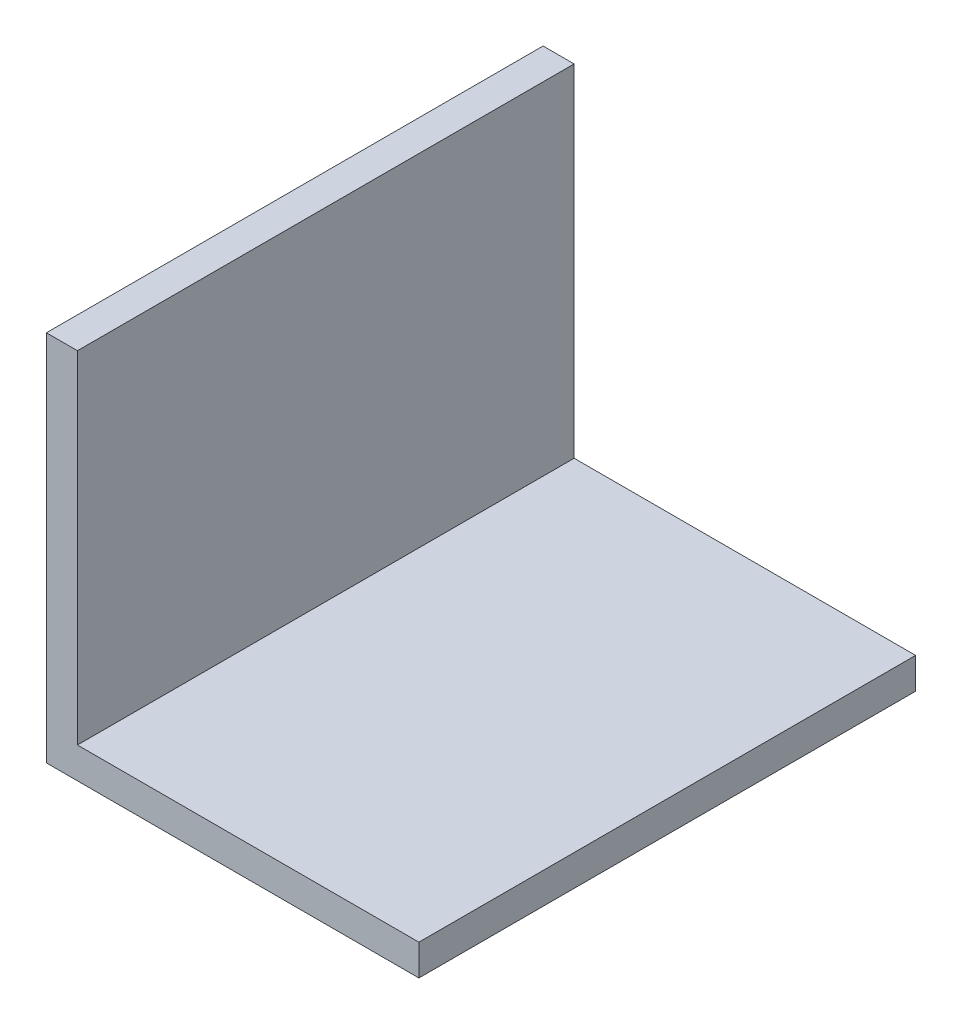
ISO-10303-21;
HEADER;
FILE_DESCRIPTION(('STEP AP214'),'2;1');
FILE_NAME('part.step','',(''),(''),'','','');
FILE_SCHEMA(('AUTOMOTIVE_DESIGN { 1 0 10303 214 1 1 1 1 }'));
ENDSEC;
DATA;
#1=APPLICATION_CONTEXT('core data for automotive mechanical design processes');
#2=APPLICATION_PROTOCOL_DEFINITION('international standard','automotive_design',2000,#1);
#3=PRODUCT_CONTEXT('',#1,'mechanical');
#4=PRODUCT('Part','Part','',(#3));
#5=PRODUCT_RELATED_PRODUCT_CATEGORY('part','',(#4));
#6=PRODUCT_DEFINITION_FORMATION('','',#4);
#7=PRODUCT_DEFINITION_CONTEXT('part definition',#1,'design');
#8=PRODUCT_DEFINITION('design','',#6,#7);
#9=PRODUCT_DEFINITION_SHAPE('','',#8);
#10=(LENGTH_UNIT() NAMED_UNIT(*) SI_UNIT(.MILLI.,.METRE.));
#11=(NAMED_UNIT(*) PLANE_ANGLE_UNIT() SI_UNIT($,.RADIAN.));
#12=(NAMED_UNIT(*) SI_UNIT($,.STERADIAN.) SOLID_ANGLE_UNIT());
#13=UNCERTAINTY_MEASURE_WITH_UNIT(LENGTH_MEASURE(1.E-05),#10,'distance_accuracy_value','');
#14=(GEOMETRIC_REPRESENTATION_CONTEXT(3) GLOBAL_UNCERTAINTY_ASSIGNED_CONTEXT((#13)) GLOBAL_UNIT_ASSIGNED_CONTEXT((#10,
#11,#12)) REPRESENTATION_CONTEXT('',''));
#15=CARTESIAN_POINT('',(0.,0.,0.));
#16=DIRECTION('',(0.,0.,1.));
#17=DIRECTION('',(1.,0.,0.));
#18=AXIS2_PLACEMENT_3D('',#15,#16,#17);
#19=CARTESIAN_POINT('',(0.,0.,25.4));
#20=DIRECTION('',(0.,1.,0.));
#21=DIRECTION('',(0.,0.,1.));
#22=AXIS2_PLACEMENT_3D('',#19,#20,#21);
#23=PLANE('',#22);
#24=DIRECTION('',(1.,0.,0.));
#25=VECTOR('',#24,1.);
#26=CARTESIAN_POINT('',(0.,0.,0.));
#27=LINE('',#26,#25);
#28=CARTESIAN_POINT('',(0.,0.,0.));
#29=VERTEX_POINT('',#28);
#30=CARTESIAN_POINT('',(19.05,0.,0.));
#31=VERTEX_POINT('',#30);
#32=EDGE_CURVE('E115',#29,#31,#27,.T.);
#33=ORIENTED_EDGE('',*,*,#32,.T.);
#34=DIRECTION('',(0.,0.,-1.));
#35=VECTOR('',#34,1.);
#36=CARTESIAN_POINT('',(19.05,0.,25.4));
#37=LINE('',#36,#35);
#38=CARTESIAN_POINT('',(19.05,0.,25.4));
#39=VERTEX_POINT('',#38);
#40=EDGE_CURVE('E11',#39,#31,#37,.T.);
#41=ORIENTED_EDGE('',*,*,#40,.F.);
#42=DIRECTION('',(1.,0.,0.));
#43=VECTOR('',#42,1.);
#44=CARTESIAN_POINT('',(0.,0.,25.4));
#45=LINE('',#44,#43);
#46=CARTESIAN_POINT('',(0.,0.,25.4));
#47=VERTEX_POINT('',#46);
#48=EDGE_CURVE('E125',#47,#39,#45,.T.);
#49=ORIENTED_EDGE('',*,*,#48,.F.);
#50=DIRECTION('',(0.,0.,-1.));
#51=VECTOR('',#50,1.);
#52=CARTESIAN_POINT('',(0.,0.,25.4));
#53=LINE('',#52,#51);
#54=EDGE_CURVE('E111',#47,#29,#53,.T.);
#55=ORIENTED_EDGE('',*,*,#54,.T.);
#56=EDGE_LOOP('',(#33,#41,#49,#55));
#57=FACE_BOUND('',#56,.T.);
#58=ADVANCED_FACE('F31',(#57),#23,.F.);
#59=CARTESIAN_POINT('',(19.05,1.5875,25.4));
#60=DIRECTION('',(-1.,0.,0.));
#61=DIRECTION('',(0.,0.,1.));
#62=AXIS2_PLACEMENT_3D('',#59,#60,#61);
#63=PLANE('',#62);
#64=DIRECTION('',(0.,1.,0.));
#65=VECTOR('',#64,1.);
#66=CARTESIAN_POINT('',(19.05,1.5875,0.));
#67=LINE('',#66,#65);
#68=CARTESIAN_POINT('',(19.05,1.5875,0.));
#69=VERTEX_POINT('',#68);
#70=EDGE_CURVE('E118',#31,#69,#67,.T.);
#71=ORIENTED_EDGE('',*,*,#70,.T.);
#72=DIRECTION('',(0.,0.,-1.));
#73=VECTOR('',#72,1.);
#74=CARTESIAN_POINT('',(19.05,1.5875,25.4));
#75=LINE('',#74,#73);
#76=CARTESIAN_POINT('',(19.05,1.5875,25.4));
#77=VERTEX_POINT('',#76);
#78=EDGE_CURVE('E39',#77,#69,#75,.T.);
#79=ORIENTED_EDGE('',*,*,#78,.F.);
#80=DIRECTION('',(0.,1.,0.));
#81=VECTOR('',#80,1.);
#82=CARTESIAN_POINT('',(19.05,1.5875,25.4));
#83=LINE('',#82,#81);
#84=EDGE_CURVE('E84',#39,#77,#83,.T.);
#85=ORIENTED_EDGE('',*,*,#84,.F.);
#86=ORIENTED_EDGE('',*,*,#40,.T.);
#87=EDGE_LOOP('',(#71,#79,#85,#86));
#88=FACE_BOUND('',#87,.T.);
#89=ADVANCED_FACE('F149',(#88),#63,.F.);
#90=CARTESIAN_POINT('',(1.5875,1.5875,25.4));
#91=DIRECTION('',(0.,-1.,0.));
#92=DIRECTION('',(0.,0.,-1.));
#93=AXIS2_PLACEMENT_3D('',#90,#91,#92);
#94=PLANE('',#93);
#95=DIRECTION('',(-1.,0.,0.));
#96=VECTOR('',#95,1.);
#97=CARTESIAN_POINT('',(1.5875,1.5875,0.));
#98=LINE('',#97,#96);
#99=CARTESIAN_POINT('',(1.5875,1.5875,0.));
#100=VERTEX_POINT('',#99);
#101=EDGE_CURVE('E120',#69,#100,#98,.T.);
#102=ORIENTED_EDGE('',*,*,#101,.T.);
#103=DIRECTION('',(0.,0.,-1.));
#104=VECTOR('',#103,1.);
#105=CARTESIAN_POINT('',(1.5875,1.5875,25.4));
#106=LINE('',#105,#104);
#107=CARTESIAN_POINT('',(1.5875,1.5875,25.4));
#108=VERTEX_POINT('',#107);
#109=EDGE_CURVE('E106',#108,#100,#106,.T.);
#110=ORIENTED_EDGE('',*,*,#109,.F.);
#111=DIRECTION('',(-1.,0.,0.));
#112=VECTOR('',#111,1.);
#113=CARTESIAN_POINT('',(1.5875,1.5875,25.4));
#114=LINE('',#113,#112);
#115=EDGE_CURVE('E97',#77,#108,#114,.T.);
#116=ORIENTED_EDGE('',*,*,#115,.F.);
#117=ORIENTED_EDGE('',*,*,#78,.T.);
#118=EDGE_LOOP('',(#102,#110,#116,#117));
#119=FACE_BOUND('',#118,.T.);
#120=ADVANCED_FACE('F131',(#119),#94,.F.);
#121=CARTESIAN_POINT('',(1.5875,1.5875,25.4));
#122=DIRECTION('',(-1.,0.,0.));
#123=DIRECTION('',(0.,0.,1.));
#124=AXIS2_PLACEMENT_3D('',#121,#122,#123);
#125=PLANE('',#124);
#126=DIRECTION('',(0.,1.,0.));
#127=VECTOR('',#126,1.);
#128=CARTESIAN_POINT('',(1.5875,1.5875,0.));
#129=LINE('',#128,#127);
#130=CARTESIAN_POINT('',(1.5875,19.05,0.));
#131=VERTEX_POINT('',#130);
#132=EDGE_CURVE('E105',#100,#131,#129,.T.);
#133=ORIENTED_EDGE('',*,*,#132,.T.);
#134=DIRECTION('',(0.,0.,-1.));
#135=VECTOR('',#134,1.);
#136=CARTESIAN_POINT('',(1.5875,19.05,25.4));
#137=LINE('',#136,#135);
#138=CARTESIAN_POINT('',(1.5875,19.05,25.4));
#139=VERTEX_POINT('',#138);
#140=EDGE_CURVE('E102',#139,#131,#137,.T.);
#141=ORIENTED_EDGE('',*,*,#140,.F.);
#142=DIRECTION('',(0.,1.,0.));
#143=VECTOR('',#142,1.);
#144=CARTESIAN_POINT('',(1.5875,1.5875,25.4));
#145=LINE('',#144,#143);
#146=EDGE_CURVE('E91',#108,#139,#145,.T.);
#147=ORIENTED_EDGE('',*,*,#146,.F.);
#148=ORIENTED_EDGE('',*,*,#109,.T.);
#149=EDGE_LOOP('',(#133,#141,#147,#148));
#150=FACE_BOUND('',#149,.T.);
#151=ADVANCED_FACE('F103',(#150),#125,.F.);
#152=CARTESIAN_POINT('',(1.5875,19.05,25.4));
#153=DIRECTION('',(0.,-1.,0.));
#154=DIRECTION('',(0.,0.,-1.));
#155=AXIS2_PLACEMENT_3D('',#152,#153,#154);
#156=PLANE('',#155);
#157=DIRECTION('',(-1.,0.,0.));
#158=VECTOR('',#157,1.);
#159=CARTESIAN_POINT('',(1.5875,19.05,0.));
#160=LINE('',#159,#158);
#161=CARTESIAN_POINT('',(0.,19.05,0.));
#162=VERTEX_POINT('',#161);
#163=EDGE_CURVE('E70',#131,#162,#160,.T.);
#164=ORIENTED_EDGE('',*,*,#163,.T.);
#165=DIRECTION('',(0.,0.,-1.));
#166=VECTOR('',#165,1.);
#167=CARTESIAN_POINT('',(0.,19.05,25.4));
#168=LINE('',#167,#166);
#169=CARTESIAN_POINT('',(0.,19.05,25.4));
#170=VERTEX_POINT('',#169);
#171=EDGE_CURVE('E107',#170,#162,#168,.T.);
#172=ORIENTED_EDGE('',*,*,#171,.F.);
#173=DIRECTION('',(-1.,0.,0.));
#174=VECTOR('',#173,1.);
#175=CARTESIAN_POINT('',(1.5875,19.05,25.4));
#176=LINE('',#175,#174);
#177=EDGE_CURVE('E95',#139,#170,#176,.T.);
#178=ORIENTED_EDGE('',*,*,#177,.F.);
#179=ORIENTED_EDGE('',*,*,#140,.T.);
#180=EDGE_LOOP('',(#164,#172,#178,#179));
#181=FACE_BOUND('',#180,.T.);
#182=ADVANCED_FACE('F109',(#181),#156,.F.);
#183=CARTESIAN_POINT('',(0.,0.,25.4));
#184=DIRECTION('',(1.,0.,0.));
#185=DIRECTION('',(0.,0.,-1.));
#186=AXIS2_PLACEMENT_3D('',#183,#184,#185);
#187=PLANE('',#186);
#188=DIRECTION('',(0.,-1.,0.));
#189=VECTOR('',#188,1.);
#190=CARTESIAN_POINT('',(0.,0.,0.));
#191=LINE('',#190,#189);
#192=EDGE_CURVE('E76',#162,#29,#191,.T.);
#193=ORIENTED_EDGE('',*,*,#192,.T.);
#194=ORIENTED_EDGE('',*,*,#54,.F.);
#195=DIRECTION('',(0.,-1.,0.));
#196=VECTOR('',#195,1.);
#197=CARTESIAN_POINT('',(0.,0.,25.4));
#198=LINE('',#197,#196);
#199=EDGE_CURVE('E47',#170,#47,#198,.T.);
#200=ORIENTED_EDGE('',*,*,#199,.F.);
#201=ORIENTED_EDGE('',*,*,#171,.T.);
#202=EDGE_LOOP('',(#193,#194,#200,#201));
#203=FACE_BOUND('',#202,.T.);
#204=ADVANCED_FACE('F138',(#203),#187,.F.);
#205=CARTESIAN_POINT('',(19.05,0.,25.4));
#206=DIRECTION('',(0.,0.,-1.));
#207=DIRECTION('',(-1.,0.,0.));
#208=AXIS2_PLACEMENT_3D('',#205,#206,#207);
#209=PLANE('',#208);
#210=ORIENTED_EDGE('',*,*,#48,.T.);
#211=ORIENTED_EDGE('',*,*,#84,.T.);
#212=ORIENTED_EDGE('',*,*,#115,.T.);
#213=ORIENTED_EDGE('',*,*,#146,.T.);
#214=ORIENTED_EDGE('',*,*,#177,.T.);
#215=ORIENTED_EDGE('',*,*,#199,.T.);
#216=EDGE_LOOP('',(#210,#211,#212,#213,#214,#215));
#217=FACE_BOUND('',#216,.T.);
#218=ADVANCED_FACE('F93',(#217),#209,.F.);
#219=CARTESIAN_POINT('',(19.05,0.,0.));
#220=DIRECTION('',(0.,0.,-1.));
#221=DIRECTION('',(-1.,0.,0.));
#222=AXIS2_PLACEMENT_3D('',#219,#220,#221);
#223=PLANE('',#222);
#224=ORIENTED_EDGE('',*,*,#32,.F.);
#225=ORIENTED_EDGE('',*,*,#192,.F.);
#226=ORIENTED_EDGE('',*,*,#163,.F.);
#227=ORIENTED_EDGE('',*,*,#132,.F.);
#228=ORIENTED_EDGE('',*,*,#101,.F.);
#229=ORIENTED_EDGE('',*,*,#70,.F.);
#230=EDGE_LOOP('',(#224,#225,#226,#227,#228,#229));
#231=FACE_BOUND('',#230,.T.);
#232=ADVANCED_FACE('F134',(#231),#223,.T.);
#233=CLOSED_SHELL('',(#58,#89,#120,#151,#182,#204,#218,#232));
#234=MANIFOLD_SOLID_BREP('B2',#233);
#235=ADVANCED_BREP_SHAPE_REPRESENTATION('',(#18,#234),#14);
#236=SHAPE_DEFINITION_REPRESENTATION(#9,#235);
ENDSEC;
END-ISO-10303-21;
